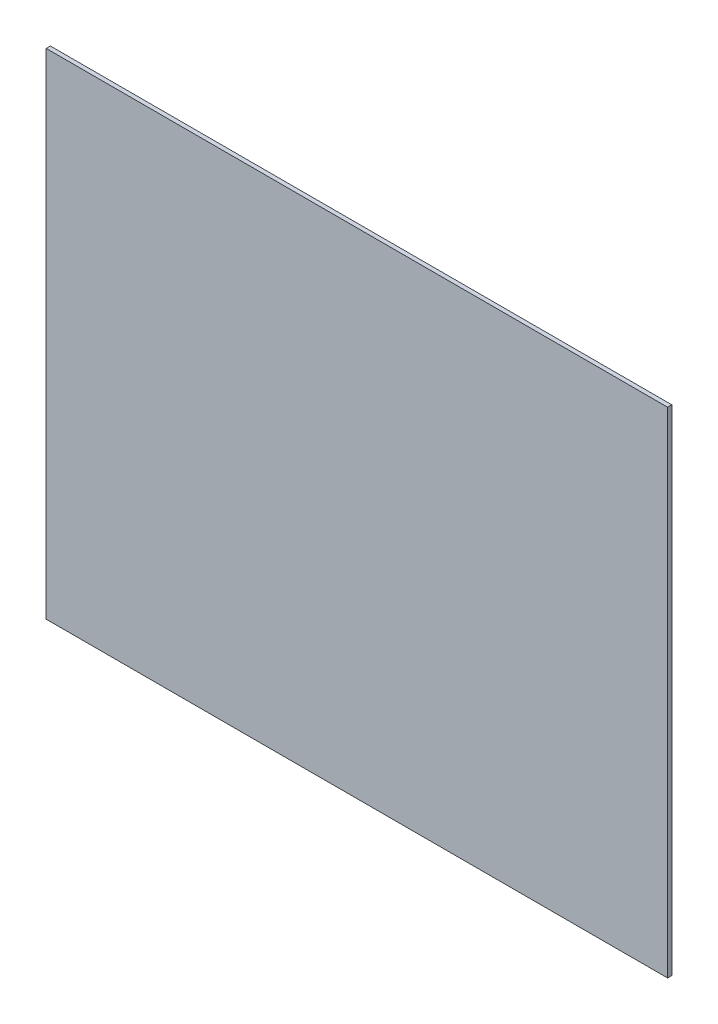
ISO-10303-21;
HEADER;
FILE_DESCRIPTION(('STEP AP214'),'2;1');
FILE_NAME('part.step','',(''),(''),'','','');
FILE_SCHEMA(('AUTOMOTIVE_DESIGN { 1 0 10303 214 1 1 1 1 }'));
ENDSEC;
DATA;
#1=APPLICATION_CONTEXT('core data for automotive mechanical design processes');
#2=APPLICATION_PROTOCOL_DEFINITION('international standard','automotive_design',2000,#1);
#3=PRODUCT_CONTEXT('',#1,'mechanical');
#4=PRODUCT('Part','Part','',(#3));
#5=PRODUCT_RELATED_PRODUCT_CATEGORY('part','',(#4));
#6=PRODUCT_DEFINITION_FORMATION('','',#4);
#7=PRODUCT_DEFINITION_CONTEXT('part definition',#1,'design');
#8=PRODUCT_DEFINITION('design','',#6,#7);
#9=PRODUCT_DEFINITION_SHAPE('','',#8);
#10=(LENGTH_UNIT() NAMED_UNIT(*) SI_UNIT(.MILLI.,.METRE.));
#11=(NAMED_UNIT(*) PLANE_ANGLE_UNIT() SI_UNIT($,.RADIAN.));
#12=(NAMED_UNIT(*) SI_UNIT($,.STERADIAN.) SOLID_ANGLE_UNIT());
#13=UNCERTAINTY_MEASURE_WITH_UNIT(LENGTH_MEASURE(1.E-05),#10,'distance_accuracy_value','');
#14=(GEOMETRIC_REPRESENTATION_CONTEXT(3) GLOBAL_UNCERTAINTY_ASSIGNED_CONTEXT((#13)) GLOBAL_UNIT_ASSIGNED_CONTEXT((#10,
#11,#12)) REPRESENTATION_CONTEXT('',''));
#15=CARTESIAN_POINT('',(0.,0.,0.));
#16=DIRECTION('',(0.,0.,1.));
#17=DIRECTION('',(1.,0.,0.));
#18=AXIS2_PLACEMENT_3D('',#15,#16,#17);
#19=CARTESIAN_POINT('',(0.,104.,3.));
#20=DIRECTION('',(0.,1.,0.));
#21=DIRECTION('',(0.,0.,1.));
#22=AXIS2_PLACEMENT_3D('',#19,#20,#21);
#23=PLANE('',#22);
#24=DIRECTION('',(1.,0.,0.));
#25=VECTOR('',#24,1.);
#26=CARTESIAN_POINT('',(0.,104.,0.));
#27=LINE('',#26,#25);
#28=CARTESIAN_POINT('',(0.,104.,0.));
#29=VERTEX_POINT('',#28);
#30=CARTESIAN_POINT('',(445.,104.,0.));
#31=VERTEX_POINT('',#30);
#32=EDGE_CURVE('E98',#29,#31,#27,.T.);
#33=ORIENTED_EDGE('',*,*,#32,.F.);
#34=DIRECTION('',(0.,0.,-1.));
#35=VECTOR('',#34,1.);
#36=CARTESIAN_POINT('',(0.,104.,3.));
#37=LINE('',#36,#35);
#38=CARTESIAN_POINT('',(0.,104.,3.));
#39=VERTEX_POINT('',#38);
#40=EDGE_CURVE('E11',#39,#29,#37,.T.);
#41=ORIENTED_EDGE('',*,*,#40,.F.);
#42=DIRECTION('',(1.,0.,0.));
#43=VECTOR('',#42,1.);
#44=CARTESIAN_POINT('',(0.,104.,3.));
#45=LINE('',#44,#43);
#46=CARTESIAN_POINT('',(445.,104.,3.));
#47=VERTEX_POINT('',#46);
#48=EDGE_CURVE('E93',#39,#47,#45,.T.);
#49=ORIENTED_EDGE('',*,*,#48,.T.);
#50=DIRECTION('',(0.,0.,-1.));
#51=VECTOR('',#50,1.);
#52=CARTESIAN_POINT('',(445.,104.,3.));
#53=LINE('',#52,#51);
#54=EDGE_CURVE('E36',#47,#31,#53,.T.);
#55=ORIENTED_EDGE('',*,*,#54,.T.);
#56=EDGE_LOOP('',(#33,#41,#49,#55));
#57=FACE_BOUND('',#56,.T.);
#58=ADVANCED_FACE('F33',(#57),#23,.T.);
#59=CARTESIAN_POINT('',(0.,104.,3.));
#60=DIRECTION('',(1.,0.,0.));
#61=DIRECTION('',(0.,0.,-1.));
#62=AXIS2_PLACEMENT_3D('',#59,#60,#61);
#63=PLANE('',#62);
#64=DIRECTION('',(0.,-1.,0.));
#65=VECTOR('',#64,1.);
#66=CARTESIAN_POINT('',(0.,104.,0.));
#67=LINE('',#66,#65);
#68=CARTESIAN_POINT('',(0.,-250.,0.));
#69=VERTEX_POINT('',#68);
#70=EDGE_CURVE('E66',#29,#69,#67,.T.);
#71=ORIENTED_EDGE('',*,*,#70,.T.);
#72=DIRECTION('',(0.,0.,-1.));
#73=VECTOR('',#72,1.);
#74=CARTESIAN_POINT('',(0.,-250.,3.));
#75=LINE('',#74,#73);
#76=CARTESIAN_POINT('',(0.,-250.,3.));
#77=VERTEX_POINT('',#76);
#78=EDGE_CURVE('E42',#77,#69,#75,.T.);
#79=ORIENTED_EDGE('',*,*,#78,.F.);
#80=DIRECTION('',(0.,-1.,0.));
#81=VECTOR('',#80,1.);
#82=CARTESIAN_POINT('',(0.,104.,3.));
#83=LINE('',#82,#81);
#84=EDGE_CURVE('E83',#39,#77,#83,.T.);
#85=ORIENTED_EDGE('',*,*,#84,.F.);
#86=ORIENTED_EDGE('',*,*,#40,.T.);
#87=EDGE_LOOP('',(#71,#79,#85,#86));
#88=FACE_BOUND('',#87,.T.);
#89=ADVANCED_FACE('F108',(#88),#63,.F.);
#90=CARTESIAN_POINT('',(0.,-250.,3.));
#91=DIRECTION('',(0.,1.,0.));
#92=DIRECTION('',(0.,0.,1.));
#93=AXIS2_PLACEMENT_3D('',#90,#91,#92);
#94=PLANE('',#93);
#95=DIRECTION('',(1.,0.,0.));
#96=VECTOR('',#95,1.);
#97=CARTESIAN_POINT('',(0.,-250.,0.));
#98=LINE('',#97,#96);
#99=CARTESIAN_POINT('',(445.,-250.,0.));
#100=VERTEX_POINT('',#99);
#101=EDGE_CURVE('E90',#69,#100,#98,.T.);
#102=ORIENTED_EDGE('',*,*,#101,.T.);
#103=DIRECTION('',(0.,0.,-1.));
#104=VECTOR('',#103,1.);
#105=CARTESIAN_POINT('',(445.,-250.,3.));
#106=LINE('',#105,#104);
#107=CARTESIAN_POINT('',(445.,-250.,3.));
#108=VERTEX_POINT('',#107);
#109=EDGE_CURVE('E87',#108,#100,#106,.T.);
#110=ORIENTED_EDGE('',*,*,#109,.F.);
#111=DIRECTION('',(1.,0.,0.));
#112=VECTOR('',#111,1.);
#113=CARTESIAN_POINT('',(0.,-250.,3.));
#114=LINE('',#113,#112);
#115=EDGE_CURVE('E78',#77,#108,#114,.T.);
#116=ORIENTED_EDGE('',*,*,#115,.F.);
#117=ORIENTED_EDGE('',*,*,#78,.T.);
#118=EDGE_LOOP('',(#102,#110,#116,#117));
#119=FACE_BOUND('',#118,.T.);
#120=ADVANCED_FACE('F88',(#119),#94,.F.);
#121=CARTESIAN_POINT('',(445.,104.,3.));
#122=DIRECTION('',(1.,0.,0.));
#123=DIRECTION('',(0.,0.,-1.));
#124=AXIS2_PLACEMENT_3D('',#121,#122,#123);
#125=PLANE('',#124);
#126=DIRECTION('',(0.,-1.,0.));
#127=VECTOR('',#126,1.);
#128=CARTESIAN_POINT('',(445.,104.,0.));
#129=LINE('',#128,#127);
#130=EDGE_CURVE('E101',#31,#100,#129,.T.);
#131=ORIENTED_EDGE('',*,*,#130,.F.);
#132=ORIENTED_EDGE('',*,*,#54,.F.);
#133=DIRECTION('',(0.,-1.,0.));
#134=VECTOR('',#133,1.);
#135=CARTESIAN_POINT('',(445.,104.,3.));
#136=LINE('',#135,#134);
#137=EDGE_CURVE('E82',#47,#108,#136,.T.);
#138=ORIENTED_EDGE('',*,*,#137,.T.);
#139=ORIENTED_EDGE('',*,*,#109,.T.);
#140=EDGE_LOOP('',(#131,#132,#138,#139));
#141=FACE_BOUND('',#140,.T.);
#142=ADVANCED_FACE('F92',(#141),#125,.T.);
#143=CARTESIAN_POINT('',(0.,0.,3.));
#144=DIRECTION('',(0.,0.,-1.));
#145=DIRECTION('',(-1.,0.,0.));
#146=AXIS2_PLACEMENT_3D('',#143,#144,#145);
#147=PLANE('',#146);
#148=ORIENTED_EDGE('',*,*,#48,.F.);
#149=ORIENTED_EDGE('',*,*,#84,.T.);
#150=ORIENTED_EDGE('',*,*,#115,.T.);
#151=ORIENTED_EDGE('',*,*,#137,.F.);
#152=EDGE_LOOP('',(#148,#149,#150,#151));
#153=FACE_BOUND('',#152,.T.);
#154=ADVANCED_FACE('F81',(#153),#147,.F.);
#155=CARTESIAN_POINT('',(0.,0.,0.));
#156=DIRECTION('',(0.,0.,-1.));
#157=DIRECTION('',(-1.,0.,0.));
#158=AXIS2_PLACEMENT_3D('',#155,#156,#157);
#159=PLANE('',#158);
#160=ORIENTED_EDGE('',*,*,#32,.T.);
#161=ORIENTED_EDGE('',*,*,#130,.T.);
#162=ORIENTED_EDGE('',*,*,#101,.F.);
#163=ORIENTED_EDGE('',*,*,#70,.F.);
#164=EDGE_LOOP('',(#160,#161,#162,#163));
#165=FACE_BOUND('',#164,.T.);
#166=ADVANCED_FACE('F106',(#165),#159,.T.);
#167=CLOSED_SHELL('',(#58,#89,#120,#142,#154,#166));
#168=MANIFOLD_SOLID_BREP('B2',#167);
#169=ADVANCED_BREP_SHAPE_REPRESENTATION('',(#18,#168),#14);
#170=SHAPE_DEFINITION_REPRESENTATION(#9,#169);
ENDSEC;
END-ISO-10303-21;
